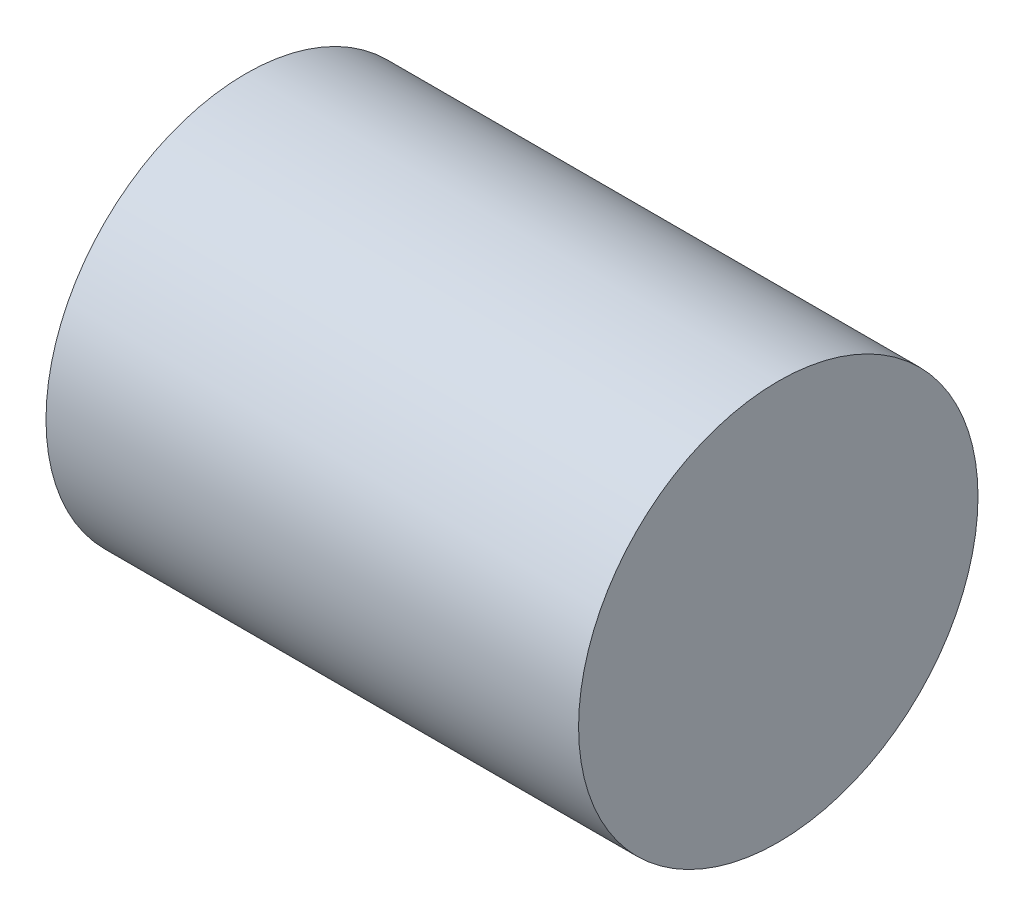
ISO-10303-21;
HEADER;
FILE_DESCRIPTION(('STEP AP214'),'2;1');
FILE_NAME('part.step','',(''),(''),'','','');
FILE_SCHEMA(('AUTOMOTIVE_DESIGN { 1 0 10303 214 1 1 1 1 }'));
ENDSEC;
DATA;
#1=APPLICATION_CONTEXT('core data for automotive mechanical design processes');
#2=APPLICATION_PROTOCOL_DEFINITION('international standard','automotive_design',2000,#1);
#3=PRODUCT_CONTEXT('',#1,'mechanical');
#4=PRODUCT('Part','Part','',(#3));
#5=PRODUCT_RELATED_PRODUCT_CATEGORY('part','',(#4));
#6=PRODUCT_DEFINITION_FORMATION('','',#4);
#7=PRODUCT_DEFINITION_CONTEXT('part definition',#1,'design');
#8=PRODUCT_DEFINITION('design','',#6,#7);
#9=PRODUCT_DEFINITION_SHAPE('','',#8);
#10=(LENGTH_UNIT() NAMED_UNIT(*) SI_UNIT(.MILLI.,.METRE.));
#11=(NAMED_UNIT(*) PLANE_ANGLE_UNIT() SI_UNIT($,.RADIAN.));
#12=(NAMED_UNIT(*) SI_UNIT($,.STERADIAN.) SOLID_ANGLE_UNIT());
#13=UNCERTAINTY_MEASURE_WITH_UNIT(LENGTH_MEASURE(1.E-05),#10,'distance_accuracy_value','');
#14=(GEOMETRIC_REPRESENTATION_CONTEXT(3) GLOBAL_UNCERTAINTY_ASSIGNED_CONTEXT((#13)) GLOBAL_UNIT_ASSIGNED_CONTEXT((#10,
#11,#12)) REPRESENTATION_CONTEXT('',''));
#15=CARTESIAN_POINT('',(0.,0.,0.));
#16=DIRECTION('',(0.,0.,1.));
#17=DIRECTION('',(1.,0.,0.));
#18=AXIS2_PLACEMENT_3D('',#15,#16,#17);
#19=CARTESIAN_POINT('',(-100.,0.,0.));
#20=DIRECTION('',(1.,0.,0.));
#21=DIRECTION('',(0.,0.,-1.));
#22=AXIS2_PLACEMENT_3D('',#19,#20,#21);
#23=CYLINDRICAL_SURFACE('',#22,75.);
#24=CARTESIAN_POINT('',(-100.,0.,0.));
#25=DIRECTION('',(1.,0.,0.));
#26=DIRECTION('',(0.,0.,-1.));
#27=AXIS2_PLACEMENT_3D('',#24,#25,#26);
#28=CIRCLE('',#27,75.);
#29=CARTESIAN_POINT('',(-100.,0.,-75.));
#30=VERTEX_POINT('',#29);
#31=EDGE_CURVE('E10',#30,#30,#28,.T.);
#32=ORIENTED_EDGE('',*,*,#31,.T.);
#33=EDGE_LOOP('',(#32));
#34=FACE_BOUND('',#33,.T.);
#35=CARTESIAN_POINT('',(100.,0.,0.));
#36=DIRECTION('',(1.,0.,0.));
#37=DIRECTION('',(0.,0.,-1.));
#38=AXIS2_PLACEMENT_3D('',#35,#36,#37);
#39=CIRCLE('',#38,75.);
#40=CARTESIAN_POINT('',(100.,0.,-75.));
#41=VERTEX_POINT('',#40);
#42=EDGE_CURVE('E44',#41,#41,#39,.T.);
#43=ORIENTED_EDGE('',*,*,#42,.F.);
#44=EDGE_LOOP('',(#43));
#45=FACE_BOUND('',#44,.T.);
#46=ADVANCED_FACE('F37',(#34,#45),#23,.T.);
#47=CARTESIAN_POINT('',(-100.,0.,0.));
#48=DIRECTION('',(1.,0.,0.));
#49=DIRECTION('',(0.,0.,-1.));
#50=AXIS2_PLACEMENT_3D('',#47,#48,#49);
#51=PLANE('',#50);
#52=ORIENTED_EDGE('',*,*,#31,.F.);
#53=EDGE_LOOP('',(#52));
#54=FACE_BOUND('',#53,.T.);
#55=ADVANCED_FACE('F54',(#54),#51,.F.);
#56=CARTESIAN_POINT('',(100.,0.,0.));
#57=DIRECTION('',(1.,0.,0.));
#58=DIRECTION('',(0.,0.,-1.));
#59=AXIS2_PLACEMENT_3D('',#56,#57,#58);
#60=PLANE('',#59);
#61=ORIENTED_EDGE('',*,*,#42,.T.);
#62=EDGE_LOOP('',(#61));
#63=FACE_BOUND('',#62,.T.);
#64=ADVANCED_FACE('F51',(#63),#60,.T.);
#65=CLOSED_SHELL('',(#46,#55,#64));
#66=MANIFOLD_SOLID_BREP('B2',#65);
#67=ADVANCED_BREP_SHAPE_REPRESENTATION('',(#18,#66),#14);
#68=SHAPE_DEFINITION_REPRESENTATION(#9,#67);
ENDSEC;
END-ISO-10303-21;
